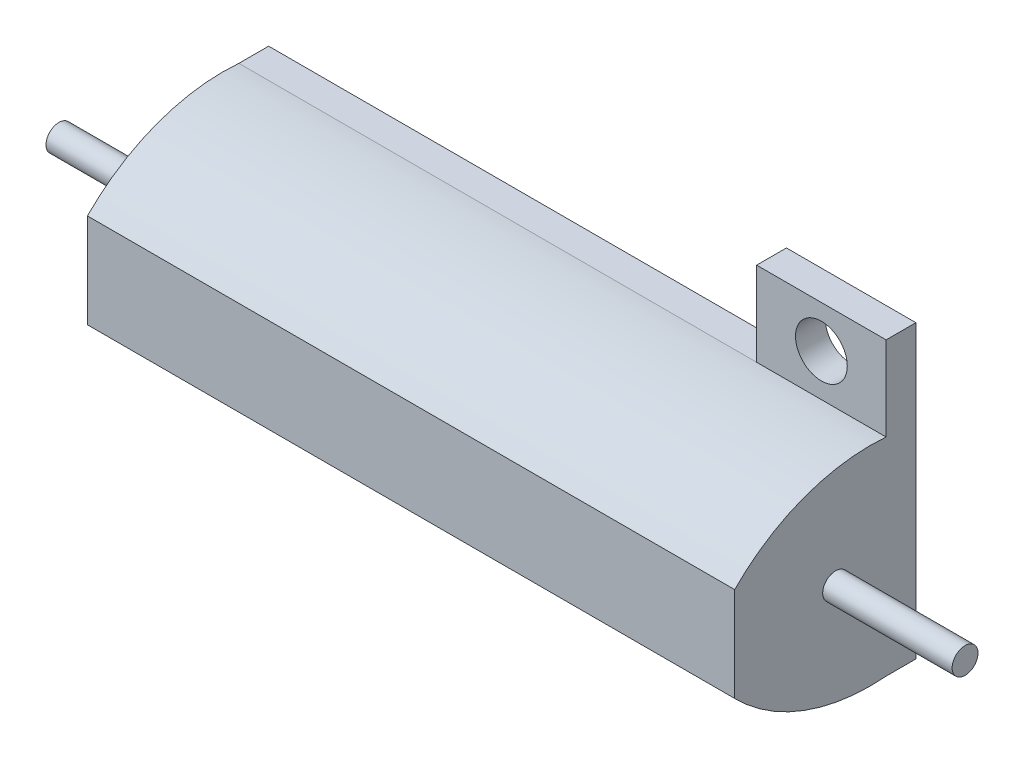
ISO-10303-21;
HEADER;
FILE_DESCRIPTION(('STEP AP214'),'2;1');
FILE_NAME('part.step','',(''),(''),'','','');
FILE_SCHEMA(('AUTOMOTIVE_DESIGN { 1 0 10303 214 1 1 1 1 }'));
ENDSEC;
DATA;
#1=APPLICATION_CONTEXT('core data for automotive mechanical design processes');
#2=APPLICATION_PROTOCOL_DEFINITION('international standard','automotive_design',2000,#1);
#3=PRODUCT_CONTEXT('',#1,'mechanical');
#4=PRODUCT('Part','Part','',(#3));
#5=PRODUCT_RELATED_PRODUCT_CATEGORY('part','',(#4));
#6=PRODUCT_DEFINITION_FORMATION('','',#4);
#7=PRODUCT_DEFINITION_CONTEXT('part definition',#1,'design');
#8=PRODUCT_DEFINITION('design','',#6,#7);
#9=PRODUCT_DEFINITION_SHAPE('','',#8);
#10=(LENGTH_UNIT() NAMED_UNIT(*) SI_UNIT(.MILLI.,.METRE.));
#11=(NAMED_UNIT(*) PLANE_ANGLE_UNIT() SI_UNIT($,.RADIAN.));
#12=(NAMED_UNIT(*) SI_UNIT($,.STERADIAN.) SOLID_ANGLE_UNIT());
#13=UNCERTAINTY_MEASURE_WITH_UNIT(LENGTH_MEASURE(1.E-05),#10,'distance_accuracy_value','');
#14=(GEOMETRIC_REPRESENTATION_CONTEXT(3) GLOBAL_UNCERTAINTY_ASSIGNED_CONTEXT((#13)) GLOBAL_UNIT_ASSIGNED_CONTEXT((#10,
#11,#12)) REPRESENTATION_CONTEXT('',''));
#15=CARTESIAN_POINT('',(0.,0.,0.));
#16=DIRECTION('',(0.,0.,1.));
#17=DIRECTION('',(1.,0.,0.));
#18=AXIS2_PLACEMENT_3D('',#15,#16,#17);
#19=CARTESIAN_POINT('',(-25.,8.,2.3));
#20=DIRECTION('',(1.,0.,0.));
#21=DIRECTION('',(0.,0.,-1.));
#22=AXIS2_PLACEMENT_3D('',#19,#20,#21);
#23=PLANE('',#22);
#24=DIRECTION('',(0.,-1.,0.));
#25=VECTOR('',#24,1.);
#26=CARTESIAN_POINT('',(-25.,8.,0.));
#27=LINE('',#26,#25);
#28=CARTESIAN_POINT('',(-25.,8.,0.));
#29=VERTEX_POINT('',#28);
#30=CARTESIAN_POINT('',(-25.,-14.5,0.));
#31=VERTEX_POINT('',#30);
#32=EDGE_CURVE('E203',#29,#31,#27,.T.);
#33=ORIENTED_EDGE('',*,*,#32,.T.);
#34=DIRECTION('',(0.,0.,-1.));
#35=VECTOR('',#34,1.);
#36=CARTESIAN_POINT('',(-25.,-14.5,14.2268604418766));
#37=LINE('',#36,#35);
#38=CARTESIAN_POINT('',(-25.,-14.5,2.3));
#39=VERTEX_POINT('',#38);
#40=EDGE_CURVE('E205',#39,#31,#37,.T.);
#41=ORIENTED_EDGE('',*,*,#40,.F.);
#42=DIRECTION('',(0.,-1.,0.));
#43=VECTOR('',#42,1.);
#44=CARTESIAN_POINT('',(-25.,8.,2.3));
#45=LINE('',#44,#43);
#46=CARTESIAN_POINT('',(-25.,-8.,2.3));
#47=VERTEX_POINT('',#46);
#48=EDGE_CURVE('E134',#47,#39,#45,.T.);
#49=ORIENTED_EDGE('',*,*,#48,.F.);
#50=CARTESIAN_POINT('',(-25.,6.62228407737443,3.51500773701498));
#51=DIRECTION('',(1.,0.,0.));
#52=DIRECTION('',(0.,0.,-1.));
#53=AXIS2_PLACEMENT_3D('',#50,#51,#52);
#54=CIRCLE('',#53,14.672676492053);
#55=CARTESIAN_POINT('',(-25.,-3.64184631372973,14.));
#56=VERTEX_POINT('',#55);
#57=EDGE_CURVE('E167',#47,#56,#54,.F.);
#58=ORIENTED_EDGE('',*,*,#57,.T.);
#59=DIRECTION('',(0.,1.,0.));
#60=VECTOR('',#59,1.);
#61=CARTESIAN_POINT('',(-25.,-3.64184631372973,14.));
#62=LINE('',#61,#60);
#63=CARTESIAN_POINT('',(-25.,3.64184631372974,14.));
#64=VERTEX_POINT('',#63);
#65=EDGE_CURVE('E150',#56,#64,#62,.T.);
#66=ORIENTED_EDGE('',*,*,#65,.T.);
#67=CARTESIAN_POINT('',(-25.,-6.62228407737442,3.51500773701498));
#68=DIRECTION('',(1.,0.,0.));
#69=DIRECTION('',(0.,0.,-1.));
#70=AXIS2_PLACEMENT_3D('',#67,#68,#69);
#71=CIRCLE('',#70,14.672676492053);
#72=CARTESIAN_POINT('',(-25.,8.,2.3));
#73=VERTEX_POINT('',#72);
#74=EDGE_CURVE('E155',#64,#73,#71,.F.);
#75=ORIENTED_EDGE('',*,*,#74,.T.);
#76=DIRECTION('',(0.,0.,-1.));
#77=VECTOR('',#76,1.);
#78=CARTESIAN_POINT('',(-25.,8.,2.3));
#79=LINE('',#78,#77);
#80=EDGE_CURVE('E124',#73,#29,#79,.T.);
#81=ORIENTED_EDGE('',*,*,#80,.T.);
#82=EDGE_LOOP('',(#33,#41,#49,#58,#66,#75,#81));
#83=FACE_BOUND('',#82,.T.);
#84=CARTESIAN_POINT('',(-25.,0.,6.2));
#85=DIRECTION('',(1.,0.,0.));
#86=DIRECTION('',(0.,0.,-1.));
#87=AXIS2_PLACEMENT_3D('',#84,#85,#86);
#88=CIRCLE('',#87,1.);
#89=CARTESIAN_POINT('',(-25.,0.,7.2));
#90=VERTEX_POINT('',#89);
#91=EDGE_CURVE('E12',#90,#90,#88,.F.);
#92=ORIENTED_EDGE('',*,*,#91,.F.);
#93=EDGE_LOOP('',(#92));
#94=FACE_BOUND('',#93,.T.);
#95=ADVANCED_FACE('F31',(#83,#94),#23,.F.);
#96=CARTESIAN_POINT('',(25.,8.00000000000001,2.3));
#97=DIRECTION('',(-1.,0.,0.));
#98=DIRECTION('',(0.,-1.,0.));
#99=AXIS2_PLACEMENT_3D('',#96,#97,#98);
#100=PLANE('',#99);
#101=DIRECTION('',(0.,1.,0.));
#102=VECTOR('',#101,1.);
#103=CARTESIAN_POINT('',(25.,8.00000000000001,0.));
#104=LINE('',#103,#102);
#105=CARTESIAN_POINT('',(25.,-7.99999999999999,0.));
#106=VERTEX_POINT('',#105);
#107=CARTESIAN_POINT('',(25.,14.5,0.));
#108=VERTEX_POINT('',#107);
#109=EDGE_CURVE('E253',#106,#108,#104,.T.);
#110=ORIENTED_EDGE('',*,*,#109,.T.);
#111=DIRECTION('',(0.,0.,-1.));
#112=VECTOR('',#111,1.);
#113=CARTESIAN_POINT('',(25.,14.5,14.2268604418766));
#114=LINE('',#113,#112);
#115=CARTESIAN_POINT('',(25.,14.5,2.3));
#116=VERTEX_POINT('',#115);
#117=EDGE_CURVE('E175',#116,#108,#114,.T.);
#118=ORIENTED_EDGE('',*,*,#117,.F.);
#119=DIRECTION('',(0.,1.,0.));
#120=VECTOR('',#119,1.);
#121=CARTESIAN_POINT('',(25.,8.00000000000001,2.3));
#122=LINE('',#121,#120);
#123=CARTESIAN_POINT('',(25.,8.,2.3));
#124=VERTEX_POINT('',#123);
#125=EDGE_CURVE('E133',#124,#116,#122,.T.);
#126=ORIENTED_EDGE('',*,*,#125,.F.);
#127=CARTESIAN_POINT('',(25.,-6.62228407737441,3.51500773701498));
#128=DIRECTION('',(1.,0.,0.));
#129=DIRECTION('',(0.,1.,0.));
#130=AXIS2_PLACEMENT_3D('',#127,#128,#129);
#131=CIRCLE('',#130,14.672676492053);
#132=CARTESIAN_POINT('',(25.,3.64184631372975,14.));
#133=VERTEX_POINT('',#132);
#134=EDGE_CURVE('E141',#124,#133,#131,.T.);
#135=ORIENTED_EDGE('',*,*,#134,.T.);
#136=DIRECTION('',(0.,-1.,0.));
#137=VECTOR('',#136,1.);
#138=CARTESIAN_POINT('',(25.,-3.64184631372971,14.));
#139=LINE('',#138,#137);
#140=CARTESIAN_POINT('',(25.,-3.64184631372971,14.));
#141=VERTEX_POINT('',#140);
#142=EDGE_CURVE('E140',#133,#141,#139,.T.);
#143=ORIENTED_EDGE('',*,*,#142,.T.);
#144=CARTESIAN_POINT('',(25.,6.62228407737445,3.51500773701498));
#145=DIRECTION('',(1.,0.,0.));
#146=DIRECTION('',(0.,-1.,0.));
#147=AXIS2_PLACEMENT_3D('',#144,#145,#146);
#148=CIRCLE('',#147,14.672676492053);
#149=CARTESIAN_POINT('',(25.,-7.99999999999999,2.3));
#150=VERTEX_POINT('',#149);
#151=EDGE_CURVE('E131',#141,#150,#148,.T.);
#152=ORIENTED_EDGE('',*,*,#151,.T.);
#153=DIRECTION('',(0.,0.,-1.));
#154=VECTOR('',#153,1.);
#155=CARTESIAN_POINT('',(25.,-7.99999999999999,2.3));
#156=LINE('',#155,#154);
#157=EDGE_CURVE('E114',#150,#106,#156,.T.);
#158=ORIENTED_EDGE('',*,*,#157,.T.);
#159=EDGE_LOOP('',(#110,#118,#126,#135,#143,#152,#158));
#160=FACE_BOUND('',#159,.T.);
#161=CARTESIAN_POINT('',(25.,0.,6.2));
#162=DIRECTION('',(-1.,0.,0.));
#163=DIRECTION('',(0.,-1.,0.));
#164=AXIS2_PLACEMENT_3D('',#161,#162,#163);
#165=CIRCLE('',#164,1.);
#166=CARTESIAN_POINT('',(25.,0.,7.2));
#167=VERTEX_POINT('',#166);
#168=EDGE_CURVE('E34',#167,#167,#165,.F.);
#169=ORIENTED_EDGE('',*,*,#168,.F.);
#170=EDGE_LOOP('',(#169));
#171=FACE_BOUND('',#170,.T.);
#172=ADVANCED_FACE('F136',(#160,#171),#100,.F.);
#173=CARTESIAN_POINT('',(-25.,-8.,2.3));
#174=DIRECTION('',(0.,0.,1.));
#175=DIRECTION('',(1.,0.,0.));
#176=AXIS2_PLACEMENT_3D('',#173,#174,#175);
#177=PLANE('',#176);
#178=CARTESIAN_POINT('',(20.,11.25,2.3));
#179=DIRECTION('',(0.,0.,1.));
#180=DIRECTION('',(1.,0.,0.));
#181=AXIS2_PLACEMENT_3D('',#178,#179,#180);
#182=CIRCLE('',#181,2.);
#183=CARTESIAN_POINT('',(22.,11.25,2.3));
#184=VERTEX_POINT('',#183);
#185=EDGE_CURVE('E236',#184,#184,#182,.F.);
#186=ORIENTED_EDGE('',*,*,#185,.T.);
#187=EDGE_LOOP('',(#186));
#188=FACE_BOUND('',#187,.T.);
#189=DIRECTION('',(0.,1.,0.));
#190=VECTOR('',#189,1.);
#191=CARTESIAN_POINT('',(15.,8.00000000000001,2.3));
#192=LINE('',#191,#190);
#193=CARTESIAN_POINT('',(15.,8.00000000000001,2.3));
#194=VERTEX_POINT('',#193);
#195=CARTESIAN_POINT('',(15.,14.5,2.3));
#196=VERTEX_POINT('',#195);
#197=EDGE_CURVE('E266',#194,#196,#192,.T.);
#198=ORIENTED_EDGE('',*,*,#197,.F.);
#199=DIRECTION('',(1.,0.,0.));
#200=VECTOR('',#199,1.);
#201=CARTESIAN_POINT('',(-44.9028960737189,7.99999999999999,2.3));
#202=LINE('',#201,#200);
#203=EDGE_CURVE('E46',#194,#124,#202,.T.);
#204=ORIENTED_EDGE('',*,*,#203,.T.);
#205=ORIENTED_EDGE('',*,*,#125,.T.);
#206=DIRECTION('',(1.,0.,0.));
#207=VECTOR('',#206,1.);
#208=CARTESIAN_POINT('',(25.,14.5,2.3));
#209=LINE('',#208,#207);
#210=EDGE_CURVE('E169',#196,#116,#209,.T.);
#211=ORIENTED_EDGE('',*,*,#210,.F.);
#212=EDGE_LOOP('',(#198,#204,#205,#211));
#213=FACE_BOUND('',#212,.T.);
#214=ADVANCED_FACE('F199',(#188,#213),#177,.T.);
#215=CARTESIAN_POINT('',(-25.,-8.,2.3));
#216=DIRECTION('',(0.,1.,0.));
#217=DIRECTION('',(-1.,0.,0.));
#218=AXIS2_PLACEMENT_3D('',#215,#216,#217);
#219=PLANE('',#218);
#220=DIRECTION('',(1.,0.,0.));
#221=VECTOR('',#220,1.);
#222=CARTESIAN_POINT('',(-25.,-8.,2.3));
#223=LINE('',#222,#221);
#224=CARTESIAN_POINT('',(-15.,-8.,2.3));
#225=VERTEX_POINT('',#224);
#226=EDGE_CURVE('E118',#225,#150,#223,.T.);
#227=ORIENTED_EDGE('',*,*,#226,.F.);
#228=DIRECTION('',(0.,0.,-1.));
#229=VECTOR('',#228,1.);
#230=CARTESIAN_POINT('',(-15.,-8.,14.2268604418766));
#231=LINE('',#230,#229);
#232=CARTESIAN_POINT('',(-15.,-8.,0.));
#233=VERTEX_POINT('',#232);
#234=EDGE_CURVE('E234',#225,#233,#231,.T.);
#235=ORIENTED_EDGE('',*,*,#234,.T.);
#236=DIRECTION('',(1.,0.,0.));
#237=VECTOR('',#236,1.);
#238=CARTESIAN_POINT('',(-25.,-8.,0.));
#239=LINE('',#238,#237);
#240=EDGE_CURVE('E120',#233,#106,#239,.T.);
#241=ORIENTED_EDGE('',*,*,#240,.T.);
#242=ORIENTED_EDGE('',*,*,#157,.F.);
#243=EDGE_LOOP('',(#227,#235,#241,#242));
#244=FACE_BOUND('',#243,.T.);
#245=ADVANCED_FACE('F116',(#244),#219,.F.);
#246=CARTESIAN_POINT('',(-25.,8.,2.3));
#247=DIRECTION('',(0.,-1.,0.));
#248=DIRECTION('',(1.,0.,0.));
#249=AXIS2_PLACEMENT_3D('',#246,#247,#248);
#250=PLANE('',#249);
#251=DIRECTION('',(-1.,0.,0.));
#252=VECTOR('',#251,1.);
#253=CARTESIAN_POINT('',(-25.,8.,2.3));
#254=LINE('',#253,#252);
#255=EDGE_CURVE('E254',#194,#73,#254,.T.);
#256=ORIENTED_EDGE('',*,*,#255,.F.);
#257=DIRECTION('',(0.,0.,-1.));
#258=VECTOR('',#257,1.);
#259=CARTESIAN_POINT('',(15.,8.00000000000001,14.2268604418766));
#260=LINE('',#259,#258);
#261=CARTESIAN_POINT('',(15.,8.00000000000001,0.));
#262=VERTEX_POINT('',#261);
#263=EDGE_CURVE('E270',#194,#262,#260,.T.);
#264=ORIENTED_EDGE('',*,*,#263,.T.);
#265=DIRECTION('',(-1.,0.,0.));
#266=VECTOR('',#265,1.);
#267=CARTESIAN_POINT('',(-25.,8.,0.));
#268=LINE('',#267,#266);
#269=EDGE_CURVE('E250',#262,#29,#268,.T.);
#270=ORIENTED_EDGE('',*,*,#269,.T.);
#271=ORIENTED_EDGE('',*,*,#80,.F.);
#272=EDGE_LOOP('',(#256,#264,#270,#271));
#273=FACE_BOUND('',#272,.T.);
#274=ADVANCED_FACE('F340',(#273),#250,.F.);
#275=DIRECTION('',(1.,0.,0.));
#276=VECTOR('',#275,1.);
#277=CARTESIAN_POINT('',(-44.9028960737189,-8.00000000000001,2.3));
#278=LINE('',#277,#276);
#279=EDGE_CURVE('E54',#47,#225,#278,.T.);
#280=ORIENTED_EDGE('',*,*,#279,.F.);
#281=ORIENTED_EDGE('',*,*,#48,.T.);
#282=DIRECTION('',(-1.,0.,0.));
#283=VECTOR('',#282,1.);
#284=CARTESIAN_POINT('',(-25.,-14.5,2.3));
#285=LINE('',#284,#283);
#286=CARTESIAN_POINT('',(-15.,-14.5,2.3));
#287=VERTEX_POINT('',#286);
#288=EDGE_CURVE('E217',#287,#39,#285,.T.);
#289=ORIENTED_EDGE('',*,*,#288,.F.);
#290=DIRECTION('',(0.,-1.,0.));
#291=VECTOR('',#290,1.);
#292=CARTESIAN_POINT('',(-15.,-8.,2.3));
#293=LINE('',#292,#291);
#294=EDGE_CURVE('E218',#225,#287,#293,.T.);
#295=ORIENTED_EDGE('',*,*,#294,.F.);
#296=EDGE_LOOP('',(#280,#281,#289,#295));
#297=FACE_BOUND('',#296,.T.);
#298=CARTESIAN_POINT('',(-20.,-11.25,2.3));
#299=DIRECTION('',(0.,0.,1.));
#300=DIRECTION('',(1.,0.,0.));
#301=AXIS2_PLACEMENT_3D('',#298,#299,#300);
#302=CIRCLE('',#301,2.);
#303=CARTESIAN_POINT('',(-18.,-11.25,2.3));
#304=VERTEX_POINT('',#303);
#305=EDGE_CURVE('E210',#304,#304,#302,.F.);
#306=ORIENTED_EDGE('',*,*,#305,.T.);
#307=EDGE_LOOP('',(#306));
#308=FACE_BOUND('',#307,.T.);
#309=ADVANCED_FACE('F337',(#297,#308),#177,.T.);
#310=CARTESIAN_POINT('',(-25.,-8.,0.));
#311=DIRECTION('',(0.,0.,1.));
#312=DIRECTION('',(1.,0.,0.));
#313=AXIS2_PLACEMENT_3D('',#310,#311,#312);
#314=PLANE('',#313);
#315=ORIENTED_EDGE('',*,*,#32,.F.);
#316=ORIENTED_EDGE('',*,*,#269,.F.);
#317=DIRECTION('',(0.,1.,0.));
#318=VECTOR('',#317,1.);
#319=CARTESIAN_POINT('',(15.,8.00000000000001,0.));
#320=LINE('',#319,#318);
#321=CARTESIAN_POINT('',(15.,14.5,0.));
#322=VERTEX_POINT('',#321);
#323=EDGE_CURVE('E275',#262,#322,#320,.T.);
#324=ORIENTED_EDGE('',*,*,#323,.T.);
#325=DIRECTION('',(1.,0.,0.));
#326=VECTOR('',#325,1.);
#327=CARTESIAN_POINT('',(25.,14.5,0.));
#328=LINE('',#327,#326);
#329=EDGE_CURVE('E277',#322,#108,#328,.T.);
#330=ORIENTED_EDGE('',*,*,#329,.T.);
#331=ORIENTED_EDGE('',*,*,#109,.F.);
#332=ORIENTED_EDGE('',*,*,#240,.F.);
#333=DIRECTION('',(0.,-1.,0.));
#334=VECTOR('',#333,1.);
#335=CARTESIAN_POINT('',(-15.,-8.,0.));
#336=LINE('',#335,#334);
#337=CARTESIAN_POINT('',(-15.,-14.5,0.));
#338=VERTEX_POINT('',#337);
#339=EDGE_CURVE('E223',#233,#338,#336,.T.);
#340=ORIENTED_EDGE('',*,*,#339,.T.);
#341=DIRECTION('',(-1.,0.,0.));
#342=VECTOR('',#341,1.);
#343=CARTESIAN_POINT('',(-25.,-14.5,0.));
#344=LINE('',#343,#342);
#345=EDGE_CURVE('E216',#338,#31,#344,.T.);
#346=ORIENTED_EDGE('',*,*,#345,.T.);
#347=EDGE_LOOP('',(#315,#316,#324,#330,#331,#332,#340,#346));
#348=FACE_BOUND('',#347,.T.);
#349=CARTESIAN_POINT('',(-20.,-11.25,0.));
#350=DIRECTION('',(0.,0.,-1.));
#351=DIRECTION('',(-1.,0.,0.));
#352=AXIS2_PLACEMENT_3D('',#349,#350,#351);
#353=CIRCLE('',#352,2.);
#354=CARTESIAN_POINT('',(-22.,-11.25,0.));
#355=VERTEX_POINT('',#354);
#356=EDGE_CURVE('E227',#355,#355,#353,.T.);
#357=ORIENTED_EDGE('',*,*,#356,.F.);
#358=EDGE_LOOP('',(#357));
#359=FACE_BOUND('',#358,.T.);
#360=CARTESIAN_POINT('',(20.,11.25,0.));
#361=DIRECTION('',(0.,0.,-1.));
#362=DIRECTION('',(-1.,0.,0.));
#363=AXIS2_PLACEMENT_3D('',#360,#361,#362);
#364=CIRCLE('',#363,2.);
#365=CARTESIAN_POINT('',(18.,11.25,0.));
#366=VERTEX_POINT('',#365);
#367=EDGE_CURVE('E273',#366,#366,#364,.T.);
#368=ORIENTED_EDGE('',*,*,#367,.F.);
#369=EDGE_LOOP('',(#368));
#370=FACE_BOUND('',#369,.T.);
#371=ADVANCED_FACE('F221',(#348,#359,#370),#314,.F.);
#372=CARTESIAN_POINT('',(-25.,-14.5,14.2268604418766));
#373=DIRECTION('',(0.,-1.,0.));
#374=DIRECTION('',(1.,0.,0.));
#375=AXIS2_PLACEMENT_3D('',#372,#373,#374);
#376=PLANE('',#375);
#377=DIRECTION('',(0.,0.,-1.));
#378=VECTOR('',#377,1.);
#379=CARTESIAN_POINT('',(-15.,-14.5,14.2268604418766));
#380=LINE('',#379,#378);
#381=EDGE_CURVE('E238',#287,#338,#380,.T.);
#382=ORIENTED_EDGE('',*,*,#381,.F.);
#383=ORIENTED_EDGE('',*,*,#288,.T.);
#384=ORIENTED_EDGE('',*,*,#40,.T.);
#385=ORIENTED_EDGE('',*,*,#345,.F.);
#386=EDGE_LOOP('',(#382,#383,#384,#385));
#387=FACE_BOUND('',#386,.T.);
#388=ADVANCED_FACE('F215',(#387),#376,.T.);
#389=CARTESIAN_POINT('',(-15.,-8.,14.2268604418766));
#390=DIRECTION('',(1.,0.,0.));
#391=DIRECTION('',(0.,1.,0.));
#392=AXIS2_PLACEMENT_3D('',#389,#390,#391);
#393=PLANE('',#392);
#394=ORIENTED_EDGE('',*,*,#234,.F.);
#395=ORIENTED_EDGE('',*,*,#294,.T.);
#396=ORIENTED_EDGE('',*,*,#381,.T.);
#397=ORIENTED_EDGE('',*,*,#339,.F.);
#398=EDGE_LOOP('',(#394,#395,#396,#397));
#399=FACE_BOUND('',#398,.T.);
#400=ADVANCED_FACE('F326',(#399),#393,.T.);
#401=CARTESIAN_POINT('',(-20.,-11.25,14.2268604418766));
#402=DIRECTION('',(0.,0.,-1.));
#403=DIRECTION('',(-1.,0.,0.));
#404=AXIS2_PLACEMENT_3D('',#401,#402,#403);
#405=CYLINDRICAL_SURFACE('',#404,2.);
#406=ORIENTED_EDGE('',*,*,#356,.T.);
#407=EDGE_LOOP('',(#406));
#408=FACE_BOUND('',#407,.T.);
#409=ORIENTED_EDGE('',*,*,#305,.F.);
#410=EDGE_LOOP('',(#409));
#411=FACE_BOUND('',#410,.T.);
#412=ADVANCED_FACE('F323',(#408,#411),#405,.F.);
#413=CARTESIAN_POINT('',(25.,14.5,14.2268604418766));
#414=DIRECTION('',(0.,1.,0.));
#415=DIRECTION('',(-1.,0.,0.));
#416=AXIS2_PLACEMENT_3D('',#413,#414,#415);
#417=PLANE('',#416);
#418=DIRECTION('',(0.,0.,-1.));
#419=VECTOR('',#418,1.);
#420=CARTESIAN_POINT('',(15.,14.5,14.2268604418766));
#421=LINE('',#420,#419);
#422=EDGE_CURVE('E269',#196,#322,#421,.T.);
#423=ORIENTED_EDGE('',*,*,#422,.F.);
#424=ORIENTED_EDGE('',*,*,#210,.T.);
#425=ORIENTED_EDGE('',*,*,#117,.T.);
#426=ORIENTED_EDGE('',*,*,#329,.F.);
#427=EDGE_LOOP('',(#423,#424,#425,#426));
#428=FACE_BOUND('',#427,.T.);
#429=ADVANCED_FACE('F294',(#428),#417,.T.);
#430=CARTESIAN_POINT('',(15.,8.00000000000001,14.2268604418766));
#431=DIRECTION('',(-1.,0.,0.));
#432=DIRECTION('',(0.,-1.,0.));
#433=AXIS2_PLACEMENT_3D('',#430,#431,#432);
#434=PLANE('',#433);
#435=ORIENTED_EDGE('',*,*,#263,.F.);
#436=ORIENTED_EDGE('',*,*,#197,.T.);
#437=ORIENTED_EDGE('',*,*,#422,.T.);
#438=ORIENTED_EDGE('',*,*,#323,.F.);
#439=EDGE_LOOP('',(#435,#436,#437,#438));
#440=FACE_BOUND('',#439,.T.);
#441=ADVANCED_FACE('F292',(#440),#434,.T.);
#442=CARTESIAN_POINT('',(20.,11.25,14.2268604418766));
#443=DIRECTION('',(0.,0.,-1.));
#444=DIRECTION('',(-1.,0.,0.));
#445=AXIS2_PLACEMENT_3D('',#442,#443,#444);
#446=CYLINDRICAL_SURFACE('',#445,2.);
#447=ORIENTED_EDGE('',*,*,#367,.T.);
#448=EDGE_LOOP('',(#447));
#449=FACE_BOUND('',#448,.T.);
#450=ORIENTED_EDGE('',*,*,#185,.F.);
#451=EDGE_LOOP('',(#450));
#452=FACE_BOUND('',#451,.T.);
#453=ADVANCED_FACE('F315',(#449,#452),#446,.F.);
#454=CARTESIAN_POINT('',(-44.9028960737189,6.62228407737443,3.51500773701498));
#455=DIRECTION('',(1.,0.,0.));
#456=DIRECTION('',(0.,1.,0.));
#457=AXIS2_PLACEMENT_3D('',#454,#455,#456);
#458=CYLINDRICAL_SURFACE('',#457,14.672676492053);
#459=ORIENTED_EDGE('',*,*,#57,.F.);
#460=ORIENTED_EDGE('',*,*,#279,.T.);
#461=ORIENTED_EDGE('',*,*,#226,.T.);
#462=ORIENTED_EDGE('',*,*,#151,.F.);
#463=DIRECTION('',(1.,0.,0.));
#464=VECTOR('',#463,1.);
#465=CARTESIAN_POINT('',(-44.9028960737189,-3.64184631372973,14.));
#466=LINE('',#465,#464);
#467=EDGE_CURVE('E153',#56,#141,#466,.T.);
#468=ORIENTED_EDGE('',*,*,#467,.F.);
#469=EDGE_LOOP('',(#459,#460,#461,#462,#468));
#470=FACE_BOUND('',#469,.T.);
#471=ADVANCED_FACE('F129',(#470),#458,.T.);
#472=CARTESIAN_POINT('',(-44.9028960737189,-3.64184631372973,14.));
#473=DIRECTION('',(0.,0.,1.));
#474=DIRECTION('',(0.,-1.,0.));
#475=AXIS2_PLACEMENT_3D('',#472,#473,#474);
#476=PLANE('',#475);
#477=ORIENTED_EDGE('',*,*,#65,.F.);
#478=ORIENTED_EDGE('',*,*,#467,.T.);
#479=ORIENTED_EDGE('',*,*,#142,.F.);
#480=DIRECTION('',(1.,0.,0.));
#481=VECTOR('',#480,1.);
#482=CARTESIAN_POINT('',(-44.9028960737189,3.64184631372973,14.));
#483=LINE('',#482,#481);
#484=EDGE_CURVE('E156',#64,#133,#483,.T.);
#485=ORIENTED_EDGE('',*,*,#484,.F.);
#486=EDGE_LOOP('',(#477,#478,#479,#485));
#487=FACE_BOUND('',#486,.T.);
#488=ADVANCED_FACE('F307',(#487),#476,.T.);
#489=CARTESIAN_POINT('',(-44.9028960737189,-6.62228407737443,3.51500773701498));
#490=DIRECTION('',(1.,0.,0.));
#491=DIRECTION('',(0.,1.,0.));
#492=AXIS2_PLACEMENT_3D('',#489,#490,#491);
#493=CYLINDRICAL_SURFACE('',#492,14.672676492053);
#494=ORIENTED_EDGE('',*,*,#74,.F.);
#495=ORIENTED_EDGE('',*,*,#484,.T.);
#496=ORIENTED_EDGE('',*,*,#134,.F.);
#497=ORIENTED_EDGE('',*,*,#203,.F.);
#498=ORIENTED_EDGE('',*,*,#255,.T.);
#499=EDGE_LOOP('',(#494,#495,#496,#497,#498));
#500=FACE_BOUND('',#499,.T.);
#501=ADVANCED_FACE('F304',(#500),#493,.T.);
#502=CARTESIAN_POINT('',(35.,8.00000000000002,2.3));
#503=DIRECTION('',(-1.,0.,0.));
#504=DIRECTION('',(0.,-1.,0.));
#505=AXIS2_PLACEMENT_3D('',#502,#503,#504);
#506=PLANE('',#505);
#507=CARTESIAN_POINT('',(35.,0.,6.2));
#508=DIRECTION('',(-1.,0.,0.));
#509=DIRECTION('',(0.,-1.,0.));
#510=AXIS2_PLACEMENT_3D('',#507,#508,#509);
#511=CIRCLE('',#510,1.);
#512=CARTESIAN_POINT('',(35.,0.,7.2));
#513=VERTEX_POINT('',#512);
#514=EDGE_CURVE('E142',#513,#513,#511,.T.);
#515=ORIENTED_EDGE('',*,*,#514,.F.);
#516=EDGE_LOOP('',(#515));
#517=FACE_BOUND('',#516,.T.);
#518=ADVANCED_FACE('F313',(#517),#506,.F.);
#519=CARTESIAN_POINT('',(47.8284271247462,0.,6.2));
#520=DIRECTION('',(-1.,0.,0.));
#521=DIRECTION('',(0.,0.,1.));
#522=AXIS2_PLACEMENT_3D('',#519,#520,#521);
#523=CYLINDRICAL_SURFACE('',#522,1.);
#524=CARTESIAN_POINT('',(35.,0.,7.2));
#525=CARTESIAN_POINT('',(34.8958333333333,0.,7.2));
#526=CARTESIAN_POINT('',(34.7916666666667,0.,7.2));
#527=CARTESIAN_POINT('',(34.5833333333333,0.,7.2));
#528=CARTESIAN_POINT('',(34.4791666666667,0.,7.2));
#529=CARTESIAN_POINT('',(34.2708333333333,0.,7.2));
#530=CARTESIAN_POINT('',(34.1666666666667,0.,7.2));
#531=CARTESIAN_POINT('',(33.9583333333333,0.,7.2));
#532=CARTESIAN_POINT('',(33.8541666666667,0.,7.2));
#533=CARTESIAN_POINT('',(33.6458333333333,0.,7.2));
#534=CARTESIAN_POINT('',(33.5416666666667,0.,7.2));
#535=CARTESIAN_POINT('',(33.3333333333333,0.,7.2));
#536=CARTESIAN_POINT('',(33.2291666666667,0.,7.2));
#537=CARTESIAN_POINT('',(33.0208333333333,0.,7.2));
#538=CARTESIAN_POINT('',(32.9166666666667,0.,7.2));
#539=CARTESIAN_POINT('',(32.7083333333333,0.,7.2));
#540=CARTESIAN_POINT('',(32.6041666666667,0.,7.2));
#541=CARTESIAN_POINT('',(32.3958333333333,0.,7.2));
#542=CARTESIAN_POINT('',(32.2916666666667,0.,7.2));
#543=CARTESIAN_POINT('',(32.0833333333333,0.,7.2));
#544=CARTESIAN_POINT('',(31.9791666666667,0.,7.2));
#545=CARTESIAN_POINT('',(31.7708333333333,0.,7.2));
#546=CARTESIAN_POINT('',(31.6666666666667,0.,7.2));
#547=CARTESIAN_POINT('',(31.4583333333333,0.,7.2));
#548=CARTESIAN_POINT('',(31.3541666666667,0.,7.2));
#549=CARTESIAN_POINT('',(31.1458333333333,0.,7.2));
#550=CARTESIAN_POINT('',(31.0416666666667,0.,7.2));
#551=CARTESIAN_POINT('',(30.8333333333333,0.,7.2));
#552=CARTESIAN_POINT('',(30.7291666666667,0.,7.2));
#553=CARTESIAN_POINT('',(30.5208333333333,0.,7.2));
#554=CARTESIAN_POINT('',(30.4166666666667,0.,7.2));
#555=CARTESIAN_POINT('',(30.2083333333333,0.,7.2));
#556=CARTESIAN_POINT('',(30.1041666666667,0.,7.2));
#557=CARTESIAN_POINT('',(29.8958333333333,0.,7.2));
#558=CARTESIAN_POINT('',(29.7916666666667,0.,7.2));
#559=CARTESIAN_POINT('',(29.5833333333333,0.,7.2));
#560=CARTESIAN_POINT('',(29.4791666666667,0.,7.2));
#561=CARTESIAN_POINT('',(29.2708333333333,0.,7.2));
#562=CARTESIAN_POINT('',(29.1666666666667,0.,7.2));
#563=CARTESIAN_POINT('',(28.9583333333333,0.,7.2));
#564=CARTESIAN_POINT('',(28.8541666666667,0.,7.2));
#565=CARTESIAN_POINT('',(28.6458333333333,0.,7.2));
#566=CARTESIAN_POINT('',(28.5416666666667,0.,7.2));
#567=CARTESIAN_POINT('',(28.3333333333333,0.,7.2));
#568=CARTESIAN_POINT('',(28.2291666666667,0.,7.2));
#569=CARTESIAN_POINT('',(28.0208333333333,0.,7.2));
#570=CARTESIAN_POINT('',(27.9166666666667,0.,7.2));
#571=CARTESIAN_POINT('',(27.7083333333333,0.,7.2));
#572=CARTESIAN_POINT('',(27.6041666666667,0.,7.2));
#573=CARTESIAN_POINT('',(27.3958333333333,0.,7.2));
#574=CARTESIAN_POINT('',(27.2916666666667,0.,7.2));
#575=CARTESIAN_POINT('',(27.0833333333333,0.,7.2));
#576=CARTESIAN_POINT('',(26.9791666666667,0.,7.2));
#577=CARTESIAN_POINT('',(26.7708333333333,0.,7.2));
#578=CARTESIAN_POINT('',(26.6666666666667,0.,7.2));
#579=CARTESIAN_POINT('',(26.4583333333333,0.,7.2));
#580=CARTESIAN_POINT('',(26.3541666666667,0.,7.2));
#581=CARTESIAN_POINT('',(26.1458333333333,0.,7.2));
#582=CARTESIAN_POINT('',(26.0416666666667,0.,7.2));
#583=CARTESIAN_POINT('',(25.8333333333333,0.,7.2));
#584=CARTESIAN_POINT('',(25.7291666666667,0.,7.2));
#585=CARTESIAN_POINT('',(25.5208333333333,0.,7.2));
#586=CARTESIAN_POINT('',(25.4166666666667,0.,7.2));
#587=CARTESIAN_POINT('',(25.2083333333333,0.,7.2));
#588=CARTESIAN_POINT('',(25.1041666666667,0.,7.2));
#589=CARTESIAN_POINT('',(25.,0.,7.2));
#590=B_SPLINE_CURVE_WITH_KNOTS('',3,(#524,#525,#526,#527,#528,#529,#530,#531,#532,#533,#534,
#535,#536,#537,#538,#539,#540,#541,#542,#543,#544,#545,#546,#547,#548,#549,#550,#551,#552,#553,
#554,#555,#556,#557,#558,#559,#560,#561,#562,#563,#564,#565,#566,#567,#568,#569,#570,#571,#572,
#573,#574,#575,#576,#577,#578,#579,#580,#581,#582,#583,#584,#585,#586,#587,#588,#589),
.UNSPECIFIED.,.F.,.F.,(4,2,2,2,2,2,2,2,2,2,2,2,2,2,2,2,2,2,2,2,2,2,2,2,2,2,2,2,2,2,2,2,4),(0.,
0.3125,0.625000000000001,0.937500000000001,1.25,1.5625,1.875,2.1875,2.5,2.8125,3.125,3.4375,
3.75,4.0625,4.375,4.6875,5.,5.3125,5.625,5.9375,6.25,6.5625,6.875,7.1875,7.5,7.8125,8.125,
8.4375,8.75,9.06250000000001,9.37500000000001,9.68750000000001,10.),.UNSPECIFIED.);
#591=EDGE_CURVE('BSEAM190',#513,#167,#590,.T.);
#592=ORIENTED_EDGE('',*,*,#514,.T.);
#593=ORIENTED_EDGE('',*,*,#168,.T.);
#594=ORIENTED_EDGE('',*,*,#591,.T.);
#595=ORIENTED_EDGE('',*,*,#591,.F.);
#596=EDGE_LOOP('',(#592,#594,#593,#595));
#597=FACE_BOUND('',#596,.T.);
#598=ADVANCED_FACE('F190',(#597),#523,.T.);
#599=CARTESIAN_POINT('',(-35.,0.,6.2));
#600=DIRECTION('',(1.,0.,0.));
#601=DIRECTION('',(0.,0.,-1.));
#602=AXIS2_PLACEMENT_3D('',#599,#600,#601);
#603=CIRCLE('',#602,1.);
#604=CARTESIAN_POINT('',(-35.,0.,7.2));
#605=VERTEX_POINT('',#604);
#606=EDGE_CURVE('E146',#605,#605,#603,.F.);
#607=CARTESIAN_POINT('',(-35.,0.,7.2));
#608=CARTESIAN_POINT('',(-34.8958333333333,0.,7.2));
#609=CARTESIAN_POINT('',(-34.7916666666667,0.,7.2));
#610=CARTESIAN_POINT('',(-34.5833333333333,0.,7.2));
#611=CARTESIAN_POINT('',(-34.4791666666667,0.,7.2));
#612=CARTESIAN_POINT('',(-34.2708333333333,0.,7.2));
#613=CARTESIAN_POINT('',(-34.1666666666667,0.,7.2));
#614=CARTESIAN_POINT('',(-33.9583333333333,0.,7.2));
#615=CARTESIAN_POINT('',(-33.8541666666667,0.,7.2));
#616=CARTESIAN_POINT('',(-33.6458333333333,0.,7.2));
#617=CARTESIAN_POINT('',(-33.5416666666667,0.,7.2));
#618=CARTESIAN_POINT('',(-33.3333333333333,0.,7.2));
#619=CARTESIAN_POINT('',(-33.2291666666667,0.,7.2));
#620=CARTESIAN_POINT('',(-33.0208333333333,0.,7.2));
#621=CARTESIAN_POINT('',(-32.9166666666667,0.,7.2));
#622=CARTESIAN_POINT('',(-32.7083333333333,0.,7.2));
#623=CARTESIAN_POINT('',(-32.6041666666667,0.,7.2));
#624=CARTESIAN_POINT('',(-32.3958333333333,0.,7.2));
#625=CARTESIAN_POINT('',(-32.2916666666667,0.,7.2));
#626=CARTESIAN_POINT('',(-32.0833333333333,0.,7.2));
#627=CARTESIAN_POINT('',(-31.9791666666667,0.,7.2));
#628=CARTESIAN_POINT('',(-31.7708333333333,0.,7.2));
#629=CARTESIAN_POINT('',(-31.6666666666667,0.,7.2));
#630=CARTESIAN_POINT('',(-31.4583333333333,0.,7.2));
#631=CARTESIAN_POINT('',(-31.3541666666667,0.,7.2));
#632=CARTESIAN_POINT('',(-31.1458333333333,0.,7.2));
#633=CARTESIAN_POINT('',(-31.0416666666667,0.,7.2));
#634=CARTESIAN_POINT('',(-30.8333333333333,0.,7.2));
#635=CARTESIAN_POINT('',(-30.7291666666667,0.,7.2));
#636=CARTESIAN_POINT('',(-30.5208333333333,0.,7.2));
#637=CARTESIAN_POINT('',(-30.4166666666667,0.,7.2));
#638=CARTESIAN_POINT('',(-30.2083333333333,0.,7.2));
#639=CARTESIAN_POINT('',(-30.1041666666667,0.,7.2));
#640=CARTESIAN_POINT('',(-29.8958333333333,0.,7.2));
#641=CARTESIAN_POINT('',(-29.7916666666667,0.,7.2));
#642=CARTESIAN_POINT('',(-29.5833333333333,0.,7.2));
#643=CARTESIAN_POINT('',(-29.4791666666667,0.,7.2));
#644=CARTESIAN_POINT('',(-29.2708333333333,0.,7.2));
#645=CARTESIAN_POINT('',(-29.1666666666667,0.,7.2));
#646=CARTESIAN_POINT('',(-28.9583333333333,0.,7.2));
#647=CARTESIAN_POINT('',(-28.8541666666667,0.,7.2));
#648=CARTESIAN_POINT('',(-28.6458333333333,0.,7.2));
#649=CARTESIAN_POINT('',(-28.5416666666667,0.,7.2));
#650=CARTESIAN_POINT('',(-28.3333333333333,0.,7.2));
#651=CARTESIAN_POINT('',(-28.2291666666667,0.,7.2));
#652=CARTESIAN_POINT('',(-28.0208333333333,0.,7.2));
#653=CARTESIAN_POINT('',(-27.9166666666667,0.,7.2));
#654=CARTESIAN_POINT('',(-27.7083333333333,0.,7.2));
#655=CARTESIAN_POINT('',(-27.6041666666667,0.,7.2));
#656=CARTESIAN_POINT('',(-27.3958333333333,0.,7.2));
#657=CARTESIAN_POINT('',(-27.2916666666667,0.,7.2));
#658=CARTESIAN_POINT('',(-27.0833333333333,0.,7.2));
#659=CARTESIAN_POINT('',(-26.9791666666667,0.,7.2));
#660=CARTESIAN_POINT('',(-26.7708333333333,0.,7.2));
#661=CARTESIAN_POINT('',(-26.6666666666667,0.,7.2));
#662=CARTESIAN_POINT('',(-26.4583333333333,0.,7.2));
#663=CARTESIAN_POINT('',(-26.3541666666667,0.,7.2));
#664=CARTESIAN_POINT('',(-26.1458333333333,0.,7.2));
#665=CARTESIAN_POINT('',(-26.0416666666667,0.,7.2));
#666=CARTESIAN_POINT('',(-25.8333333333333,0.,7.2));
#667=CARTESIAN_POINT('',(-25.7291666666667,0.,7.2));
#668=CARTESIAN_POINT('',(-25.5208333333333,0.,7.2));
#669=CARTESIAN_POINT('',(-25.4166666666667,0.,7.2));
#670=CARTESIAN_POINT('',(-25.2083333333333,0.,7.2));
#671=CARTESIAN_POINT('',(-25.1041666666667,0.,7.2));
#672=CARTESIAN_POINT('',(-25.,0.,7.2));
#673=B_SPLINE_CURVE_WITH_KNOTS('',3,(#607,#608,#609,#610,#611,#612,#613,#614,#615,#616,#617,
#618,#619,#620,#621,#622,#623,#624,#625,#626,#627,#628,#629,#630,#631,#632,#633,#634,#635,#636,
#637,#638,#639,#640,#641,#642,#643,#644,#645,#646,#647,#648,#649,#650,#651,#652,#653,#654,#655,
#656,#657,#658,#659,#660,#661,#662,#663,#664,#665,#666,#667,#668,#669,#670,#671,#672),
.UNSPECIFIED.,.F.,.F.,(4,2,2,2,2,2,2,2,2,2,2,2,2,2,2,2,2,2,2,2,2,2,2,2,2,2,2,2,2,2,2,2,4),(0.,
0.312499999999993,0.625000000000001,0.937500000000008,1.25,1.56249999999999,1.875,
2.18750000000001,2.5,2.8125,3.125,3.43750000000001,3.75,4.0625,4.375,4.68750000000001,5.,5.3125,
5.62500000000001,5.93750000000001,6.25000000000001,6.5625,6.87500000000001,7.18750000000001,
7.50000000000001,7.8125,8.12500000000001,8.43750000000001,8.75000000000001,9.0625,
9.37500000000001,9.68750000000002,10.),.UNSPECIFIED.);
#674=EDGE_CURVE('BSEAM187',#605,#90,#673,.T.);
#675=ORIENTED_EDGE('',*,*,#606,.F.);
#676=ORIENTED_EDGE('',*,*,#91,.T.);
#677=ORIENTED_EDGE('',*,*,#674,.T.);
#678=ORIENTED_EDGE('',*,*,#674,.F.);
#679=EDGE_LOOP('',(#675,#677,#676,#678));
#680=FACE_BOUND('',#679,.T.);
#681=ADVANCED_FACE('F187',(#680),#523,.T.);
#682=CARTESIAN_POINT('',(-35.,8.,2.3));
#683=DIRECTION('',(1.,0.,0.));
#684=DIRECTION('',(0.,0.,-1.));
#685=AXIS2_PLACEMENT_3D('',#682,#683,#684);
#686=PLANE('',#685);
#687=ORIENTED_EDGE('',*,*,#606,.T.);
#688=EDGE_LOOP('',(#687));
#689=FACE_BOUND('',#688,.T.);
#690=ADVANCED_FACE('F185',(#689),#686,.F.);
#691=CLOSED_SHELL('',(#95,#172,#214,#245,#274,#309,#371,#388,#400,#412,#429,#441,#453,#471,#488,
#501,#518,#598,#681,#690));
#692=MANIFOLD_SOLID_BREP('B2',#691);
#693=ADVANCED_BREP_SHAPE_REPRESENTATION('',(#18,#692),#14);
#694=SHAPE_DEFINITION_REPRESENTATION(#9,#693);
ENDSEC;
END-ISO-10303-21;
